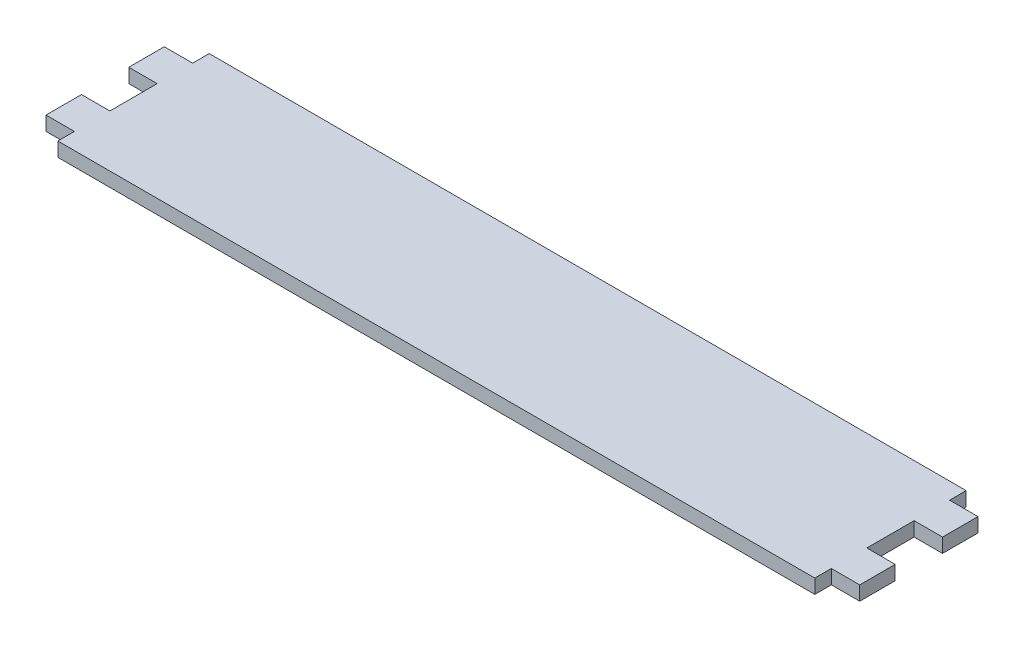
ISO-10303-21;
HEADER;
FILE_DESCRIPTION(('STEP AP214'),'2;1');
FILE_NAME('part.step','',(''),(''),'','','');
FILE_SCHEMA(('AUTOMOTIVE_DESIGN { 1 0 10303 214 1 1 1 1 }'));
ENDSEC;
DATA;
#1=APPLICATION_CONTEXT('core data for automotive mechanical design processes');
#2=APPLICATION_PROTOCOL_DEFINITION('international standard','automotive_design',2000,#1);
#3=PRODUCT_CONTEXT('',#1,'mechanical');
#4=PRODUCT('Part','Part','',(#3));
#5=PRODUCT_RELATED_PRODUCT_CATEGORY('part','',(#4));
#6=PRODUCT_DEFINITION_FORMATION('','',#4);
#7=PRODUCT_DEFINITION_CONTEXT('part definition',#1,'design');
#8=PRODUCT_DEFINITION('design','',#6,#7);
#9=PRODUCT_DEFINITION_SHAPE('','',#8);
#10=(LENGTH_UNIT() NAMED_UNIT(*) SI_UNIT(.MILLI.,.METRE.));
#11=(NAMED_UNIT(*) PLANE_ANGLE_UNIT() SI_UNIT($,.RADIAN.));
#12=(NAMED_UNIT(*) SI_UNIT($,.STERADIAN.) SOLID_ANGLE_UNIT());
#13=UNCERTAINTY_MEASURE_WITH_UNIT(LENGTH_MEASURE(1.E-05),#10,'distance_accuracy_value','');
#14=(GEOMETRIC_REPRESENTATION_CONTEXT(3) GLOBAL_UNCERTAINTY_ASSIGNED_CONTEXT((#13)) GLOBAL_UNIT_ASSIGNED_CONTEXT((#10,
#11,#12)) REPRESENTATION_CONTEXT('',''));
#15=CARTESIAN_POINT('',(0.,0.,0.));
#16=DIRECTION('',(0.,0.,1.));
#17=DIRECTION('',(1.,0.,0.));
#18=AXIS2_PLACEMENT_3D('',#15,#16,#17);
#19=CARTESIAN_POINT('',(160.,6.,-32.));
#20=DIRECTION('',(-1.,0.,0.));
#21=DIRECTION('',(0.,0.,1.));
#22=AXIS2_PLACEMENT_3D('',#19,#20,#21);
#23=PLANE('',#22);
#24=DIRECTION('',(0.,0.,-1.));
#25=VECTOR('',#24,1.);
#26=CARTESIAN_POINT('',(160.,0.,-32.));
#27=LINE('',#26,#25);
#28=CARTESIAN_POINT('',(160.,0.,32.));
#29=VERTEX_POINT('',#28);
#30=CARTESIAN_POINT('',(160.,0.,25.));
#31=VERTEX_POINT('',#30);
#32=EDGE_CURVE('E307',#29,#31,#27,.T.);
#33=ORIENTED_EDGE('',*,*,#32,.T.);
#34=DIRECTION('',(0.,1.,0.));
#35=VECTOR('',#34,1.);
#36=CARTESIAN_POINT('',(160.,6.,25.));
#37=LINE('',#36,#35);
#38=CARTESIAN_POINT('',(160.,6.,25.));
#39=VERTEX_POINT('',#38);
#40=EDGE_CURVE('E56',#31,#39,#37,.T.);
#41=ORIENTED_EDGE('',*,*,#40,.T.);
#42=DIRECTION('',(0.,0.,-1.));
#43=VECTOR('',#42,1.);
#44=CARTESIAN_POINT('',(160.,6.,-32.));
#45=LINE('',#44,#43);
#46=CARTESIAN_POINT('',(160.,6.,32.));
#47=VERTEX_POINT('',#46);
#48=EDGE_CURVE('E178',#47,#39,#45,.T.);
#49=ORIENTED_EDGE('',*,*,#48,.F.);
#50=DIRECTION('',(0.,-1.,0.));
#51=VECTOR('',#50,1.);
#52=CARTESIAN_POINT('',(160.,6.,32.));
#53=LINE('',#52,#51);
#54=EDGE_CURVE('E41',#47,#29,#53,.T.);
#55=ORIENTED_EDGE('',*,*,#54,.T.);
#56=EDGE_LOOP('',(#33,#41,#49,#55));
#57=FACE_BOUND('',#56,.T.);
#58=ADVANCED_FACE('F33',(#57),#23,.F.);
#59=CARTESIAN_POINT('',(160.,6.,-25.));
#60=VERTEX_POINT('',#59);
#61=CARTESIAN_POINT('',(160.,6.,-32.));
#62=VERTEX_POINT('',#61);
#63=EDGE_CURVE('E296',#60,#62,#45,.T.);
#64=ORIENTED_EDGE('',*,*,#63,.F.);
#65=DIRECTION('',(0.,-1.,0.));
#66=VECTOR('',#65,1.);
#67=CARTESIAN_POINT('',(160.,6.,-25.));
#68=LINE('',#67,#66);
#69=CARTESIAN_POINT('',(160.,0.,-25.));
#70=VERTEX_POINT('',#69);
#71=EDGE_CURVE('E181',#60,#70,#68,.T.);
#72=ORIENTED_EDGE('',*,*,#71,.T.);
#73=CARTESIAN_POINT('',(160.,0.,-32.));
#74=VERTEX_POINT('',#73);
#75=EDGE_CURVE('E306',#70,#74,#27,.T.);
#76=ORIENTED_EDGE('',*,*,#75,.T.);
#77=DIRECTION('',(0.,-1.,0.));
#78=VECTOR('',#77,1.);
#79=CARTESIAN_POINT('',(160.,6.,-32.));
#80=LINE('',#79,#78);
#81=EDGE_CURVE('E314',#62,#74,#80,.T.);
#82=ORIENTED_EDGE('',*,*,#81,.F.);
#83=EDGE_LOOP('',(#64,#72,#76,#82));
#84=FACE_BOUND('',#83,.T.);
#85=ADVANCED_FACE('F345',(#84),#23,.F.);
#86=CARTESIAN_POINT('',(-160.,6.,-32.));
#87=DIRECTION('',(1.,0.,0.));
#88=DIRECTION('',(0.,0.,-1.));
#89=AXIS2_PLACEMENT_3D('',#86,#87,#88);
#90=PLANE('',#89);
#91=DIRECTION('',(0.,-1.,0.));
#92=VECTOR('',#91,1.);
#93=CARTESIAN_POINT('',(-160.,6.,10.));
#94=LINE('',#93,#92);
#95=CARTESIAN_POINT('',(-160.,6.,10.));
#96=VERTEX_POINT('',#95);
#97=CARTESIAN_POINT('',(-160.,0.,10.));
#98=VERTEX_POINT('',#97);
#99=EDGE_CURVE('E235',#96,#98,#94,.T.);
#100=ORIENTED_EDGE('',*,*,#99,.F.);
#101=DIRECTION('',(0.,0.,1.));
#102=VECTOR('',#101,1.);
#103=CARTESIAN_POINT('',(-160.,6.,-32.));
#104=LINE('',#103,#102);
#105=CARTESIAN_POINT('',(-160.,6.,-10.));
#106=VERTEX_POINT('',#105);
#107=EDGE_CURVE('E293',#106,#96,#104,.T.);
#108=ORIENTED_EDGE('',*,*,#107,.F.);
#109=DIRECTION('',(0.,1.,0.));
#110=VECTOR('',#109,1.);
#111=CARTESIAN_POINT('',(-160.,6.,-10.));
#112=LINE('',#111,#110);
#113=CARTESIAN_POINT('',(-160.,0.,-10.));
#114=VERTEX_POINT('',#113);
#115=EDGE_CURVE('E267',#114,#106,#112,.T.);
#116=ORIENTED_EDGE('',*,*,#115,.F.);
#117=DIRECTION('',(0.,0.,1.));
#118=VECTOR('',#117,1.);
#119=CARTESIAN_POINT('',(-160.,0.,-32.));
#120=LINE('',#119,#118);
#121=EDGE_CURVE('E304',#114,#98,#120,.T.);
#122=ORIENTED_EDGE('',*,*,#121,.T.);
#123=EDGE_LOOP('',(#100,#108,#116,#122));
#124=FACE_BOUND('',#123,.T.);
#125=ADVANCED_FACE('F370',(#124),#90,.F.);
#126=DIRECTION('',(0.,1.,0.));
#127=VECTOR('',#126,1.);
#128=CARTESIAN_POINT('',(-160.,6.,25.));
#129=LINE('',#128,#127);
#130=CARTESIAN_POINT('',(-160.,0.,25.));
#131=VERTEX_POINT('',#130);
#132=CARTESIAN_POINT('',(-160.,6.,25.));
#133=VERTEX_POINT('',#132);
#134=EDGE_CURVE('E240',#131,#133,#129,.T.);
#135=ORIENTED_EDGE('',*,*,#134,.F.);
#136=CARTESIAN_POINT('',(-160.,0.,32.));
#137=VERTEX_POINT('',#136);
#138=EDGE_CURVE('E289',#131,#137,#120,.T.);
#139=ORIENTED_EDGE('',*,*,#138,.T.);
#140=DIRECTION('',(0.,-1.,0.));
#141=VECTOR('',#140,1.);
#142=CARTESIAN_POINT('',(-160.,6.,32.));
#143=LINE('',#142,#141);
#144=CARTESIAN_POINT('',(-160.,6.,32.));
#145=VERTEX_POINT('',#144);
#146=EDGE_CURVE('E11',#145,#137,#143,.T.);
#147=ORIENTED_EDGE('',*,*,#146,.F.);
#148=EDGE_CURVE('E294',#133,#145,#104,.T.);
#149=ORIENTED_EDGE('',*,*,#148,.F.);
#150=EDGE_LOOP('',(#135,#139,#147,#149));
#151=FACE_BOUND('',#150,.T.);
#152=ADVANCED_FACE('F376',(#151),#90,.F.);
#153=DIRECTION('',(0.,-1.,0.));
#154=VECTOR('',#153,1.);
#155=CARTESIAN_POINT('',(-160.,6.,-25.));
#156=LINE('',#155,#154);
#157=CARTESIAN_POINT('',(-160.,6.,-25.));
#158=VERTEX_POINT('',#157);
#159=CARTESIAN_POINT('',(-160.,0.,-25.));
#160=VERTEX_POINT('',#159);
#161=EDGE_CURVE('E262',#158,#160,#156,.T.);
#162=ORIENTED_EDGE('',*,*,#161,.F.);
#163=CARTESIAN_POINT('',(-160.,6.,-32.));
#164=VERTEX_POINT('',#163);
#165=EDGE_CURVE('E290',#164,#158,#104,.T.);
#166=ORIENTED_EDGE('',*,*,#165,.F.);
#167=DIRECTION('',(0.,-1.,0.));
#168=VECTOR('',#167,1.);
#169=CARTESIAN_POINT('',(-160.,6.,-32.));
#170=LINE('',#169,#168);
#171=CARTESIAN_POINT('',(-160.,0.,-32.));
#172=VERTEX_POINT('',#171);
#173=EDGE_CURVE('E300',#164,#172,#170,.T.);
#174=ORIENTED_EDGE('',*,*,#173,.T.);
#175=EDGE_CURVE('E301',#172,#160,#120,.T.);
#176=ORIENTED_EDGE('',*,*,#175,.T.);
#177=EDGE_LOOP('',(#162,#166,#174,#176));
#178=FACE_BOUND('',#177,.T.);
#179=ADVANCED_FACE('F35',(#178),#90,.F.);
#180=CARTESIAN_POINT('',(160.,6.,32.));
#181=DIRECTION('',(0.,0.,-1.));
#182=DIRECTION('',(-1.,0.,0.));
#183=AXIS2_PLACEMENT_3D('',#180,#181,#182);
#184=PLANE('',#183);
#185=DIRECTION('',(1.,0.,0.));
#186=VECTOR('',#185,1.);
#187=CARTESIAN_POINT('',(160.,0.,32.));
#188=LINE('',#187,#186);
#189=EDGE_CURVE('E303',#137,#29,#188,.T.);
#190=ORIENTED_EDGE('',*,*,#189,.T.);
#191=ORIENTED_EDGE('',*,*,#54,.F.);
#192=DIRECTION('',(1.,0.,0.));
#193=VECTOR('',#192,1.);
#194=CARTESIAN_POINT('',(160.,6.,32.));
#195=LINE('',#194,#193);
#196=EDGE_CURVE('E292',#145,#47,#195,.T.);
#197=ORIENTED_EDGE('',*,*,#196,.F.);
#198=ORIENTED_EDGE('',*,*,#146,.T.);
#199=EDGE_LOOP('',(#190,#191,#197,#198));
#200=FACE_BOUND('',#199,.T.);
#201=ADVANCED_FACE('F387',(#200),#184,.F.);
#202=CARTESIAN_POINT('',(160.,6.,10.));
#203=VERTEX_POINT('',#202);
#204=CARTESIAN_POINT('',(160.,6.,-10.));
#205=VERTEX_POINT('',#204);
#206=EDGE_CURVE('E48',#203,#205,#45,.T.);
#207=ORIENTED_EDGE('',*,*,#206,.F.);
#208=DIRECTION('',(0.,-1.,0.));
#209=VECTOR('',#208,1.);
#210=CARTESIAN_POINT('',(160.,6.,10.));
#211=LINE('',#210,#209);
#212=CARTESIAN_POINT('',(160.,0.,10.));
#213=VERTEX_POINT('',#212);
#214=EDGE_CURVE('E192',#203,#213,#211,.T.);
#215=ORIENTED_EDGE('',*,*,#214,.T.);
#216=CARTESIAN_POINT('',(160.,0.,-10.));
#217=VERTEX_POINT('',#216);
#218=EDGE_CURVE('E310',#213,#217,#27,.T.);
#219=ORIENTED_EDGE('',*,*,#218,.T.);
#220=DIRECTION('',(0.,1.,0.));
#221=VECTOR('',#220,1.);
#222=CARTESIAN_POINT('',(160.,6.,-10.));
#223=LINE('',#222,#221);
#224=EDGE_CURVE('E213',#217,#205,#223,.T.);
#225=ORIENTED_EDGE('',*,*,#224,.T.);
#226=EDGE_LOOP('',(#207,#215,#219,#225));
#227=FACE_BOUND('',#226,.T.);
#228=ADVANCED_FACE('F333',(#227),#23,.F.);
#229=CARTESIAN_POINT('',(160.,6.,-32.));
#230=DIRECTION('',(0.,0.,1.));
#231=DIRECTION('',(1.,0.,0.));
#232=AXIS2_PLACEMENT_3D('',#229,#230,#231);
#233=PLANE('',#232);
#234=DIRECTION('',(-1.,0.,0.));
#235=VECTOR('',#234,1.);
#236=CARTESIAN_POINT('',(160.,0.,-32.));
#237=LINE('',#236,#235);
#238=EDGE_CURVE('E309',#74,#172,#237,.T.);
#239=ORIENTED_EDGE('',*,*,#238,.T.);
#240=ORIENTED_EDGE('',*,*,#173,.F.);
#241=DIRECTION('',(-1.,0.,0.));
#242=VECTOR('',#241,1.);
#243=CARTESIAN_POINT('',(160.,6.,-32.));
#244=LINE('',#243,#242);
#245=EDGE_CURVE('E298',#62,#164,#244,.T.);
#246=ORIENTED_EDGE('',*,*,#245,.F.);
#247=ORIENTED_EDGE('',*,*,#81,.T.);
#248=EDGE_LOOP('',(#239,#240,#246,#247));
#249=FACE_BOUND('',#248,.T.);
#250=ADVANCED_FACE('F350',(#249),#233,.F.);
#251=CARTESIAN_POINT('',(0.,6.,0.));
#252=DIRECTION('',(0.,-1.,0.));
#253=DIRECTION('',(0.,0.,-1.));
#254=AXIS2_PLACEMENT_3D('',#251,#252,#253);
#255=PLANE('',#254);
#256=ORIENTED_EDGE('',*,*,#165,.T.);
#257=DIRECTION('',(1.,0.,0.));
#258=VECTOR('',#257,1.);
#259=CARTESIAN_POINT('',(-172.,6.,-25.));
#260=LINE('',#259,#258);
#261=CARTESIAN_POINT('',(-172.,6.,-25.));
#262=VERTEX_POINT('',#261);
#263=EDGE_CURVE('E273',#262,#158,#260,.T.);
#264=ORIENTED_EDGE('',*,*,#263,.F.);
#265=DIRECTION('',(0.,0.,-1.));
#266=VECTOR('',#265,1.);
#267=CARTESIAN_POINT('',(-172.,6.,-25.));
#268=LINE('',#267,#266);
#269=CARTESIAN_POINT('',(-172.,6.,-10.));
#270=VERTEX_POINT('',#269);
#271=EDGE_CURVE('E271',#270,#262,#268,.T.);
#272=ORIENTED_EDGE('',*,*,#271,.F.);
#273=DIRECTION('',(1.,0.,0.));
#274=VECTOR('',#273,1.);
#275=CARTESIAN_POINT('',(-172.,6.,-10.));
#276=LINE('',#275,#274);
#277=EDGE_CURVE('E280',#270,#106,#276,.T.);
#278=ORIENTED_EDGE('',*,*,#277,.T.);
#279=ORIENTED_EDGE('',*,*,#107,.T.);
#280=DIRECTION('',(1.,0.,0.));
#281=VECTOR('',#280,1.);
#282=CARTESIAN_POINT('',(-172.,6.,10.));
#283=LINE('',#282,#281);
#284=CARTESIAN_POINT('',(-172.,6.,10.));
#285=VERTEX_POINT('',#284);
#286=EDGE_CURVE('E259',#285,#96,#283,.T.);
#287=ORIENTED_EDGE('',*,*,#286,.F.);
#288=DIRECTION('',(0.,0.,-1.));
#289=VECTOR('',#288,1.);
#290=CARTESIAN_POINT('',(-172.,6.,25.));
#291=LINE('',#290,#289);
#292=CARTESIAN_POINT('',(-172.,6.,25.));
#293=VERTEX_POINT('',#292);
#294=EDGE_CURVE('E236',#293,#285,#291,.T.);
#295=ORIENTED_EDGE('',*,*,#294,.F.);
#296=DIRECTION('',(1.,0.,0.));
#297=VECTOR('',#296,1.);
#298=CARTESIAN_POINT('',(-172.,6.,25.));
#299=LINE('',#298,#297);
#300=EDGE_CURVE('E246',#293,#133,#299,.T.);
#301=ORIENTED_EDGE('',*,*,#300,.T.);
#302=ORIENTED_EDGE('',*,*,#148,.T.);
#303=ORIENTED_EDGE('',*,*,#196,.T.);
#304=ORIENTED_EDGE('',*,*,#48,.T.);
#305=DIRECTION('',(-1.,0.,0.));
#306=VECTOR('',#305,1.);
#307=CARTESIAN_POINT('',(172.,6.,25.));
#308=LINE('',#307,#306);
#309=CARTESIAN_POINT('',(172.,6.,25.));
#310=VERTEX_POINT('',#309);
#311=EDGE_CURVE('E172',#310,#39,#308,.T.);
#312=ORIENTED_EDGE('',*,*,#311,.F.);
#313=DIRECTION('',(0.,0.,-1.));
#314=VECTOR('',#313,1.);
#315=CARTESIAN_POINT('',(172.,6.,25.));
#316=LINE('',#315,#314);
#317=CARTESIAN_POINT('',(172.,6.,10.));
#318=VERTEX_POINT('',#317);
#319=EDGE_CURVE('E176',#310,#318,#316,.T.);
#320=ORIENTED_EDGE('',*,*,#319,.T.);
#321=DIRECTION('',(-1.,0.,0.));
#322=VECTOR('',#321,1.);
#323=CARTESIAN_POINT('',(172.,6.,10.));
#324=LINE('',#323,#322);
#325=EDGE_CURVE('E201',#318,#203,#324,.T.);
#326=ORIENTED_EDGE('',*,*,#325,.T.);
#327=ORIENTED_EDGE('',*,*,#206,.T.);
#328=DIRECTION('',(-1.,0.,0.));
#329=VECTOR('',#328,1.);
#330=CARTESIAN_POINT('',(172.,6.,-10.));
#331=LINE('',#330,#329);
#332=CARTESIAN_POINT('',(172.,6.,-10.));
#333=VERTEX_POINT('',#332);
#334=EDGE_CURVE('E230',#333,#205,#331,.T.);
#335=ORIENTED_EDGE('',*,*,#334,.F.);
#336=DIRECTION('',(0.,0.,-1.));
#337=VECTOR('',#336,1.);
#338=CARTESIAN_POINT('',(172.,6.,-25.));
#339=LINE('',#338,#337);
#340=CARTESIAN_POINT('',(172.,6.,-25.));
#341=VERTEX_POINT('',#340);
#342=EDGE_CURVE('E212',#333,#341,#339,.T.);
#343=ORIENTED_EDGE('',*,*,#342,.T.);
#344=DIRECTION('',(-1.,0.,0.));
#345=VECTOR('',#344,1.);
#346=CARTESIAN_POINT('',(172.,6.,-25.));
#347=LINE('',#346,#345);
#348=EDGE_CURVE('E233',#341,#60,#347,.T.);
#349=ORIENTED_EDGE('',*,*,#348,.T.);
#350=ORIENTED_EDGE('',*,*,#63,.T.);
#351=ORIENTED_EDGE('',*,*,#245,.T.);
#352=EDGE_LOOP('',(#256,#264,#272,#278,#279,#287,#295,#301,#302,#303,#304,#312,#320,#326,#327,
#335,#343,#349,#350,#351));
#353=FACE_BOUND('',#352,.T.);
#354=ADVANCED_FACE('F175',(#353),#255,.F.);
#355=CARTESIAN_POINT('',(0.,0.,0.));
#356=DIRECTION('',(0.,-1.,0.));
#357=DIRECTION('',(0.,0.,-1.));
#358=AXIS2_PLACEMENT_3D('',#355,#356,#357);
#359=PLANE('',#358);
#360=ORIENTED_EDGE('',*,*,#175,.F.);
#361=ORIENTED_EDGE('',*,*,#238,.F.);
#362=ORIENTED_EDGE('',*,*,#75,.F.);
#363=DIRECTION('',(-1.,0.,0.));
#364=VECTOR('',#363,1.);
#365=CARTESIAN_POINT('',(172.,0.,-25.));
#366=LINE('',#365,#364);
#367=CARTESIAN_POINT('',(172.,0.,-25.));
#368=VERTEX_POINT('',#367);
#369=EDGE_CURVE('E222',#368,#70,#366,.T.);
#370=ORIENTED_EDGE('',*,*,#369,.F.);
#371=DIRECTION('',(0.,0.,1.));
#372=VECTOR('',#371,1.);
#373=CARTESIAN_POINT('',(172.,0.,-25.));
#374=LINE('',#373,#372);
#375=CARTESIAN_POINT('',(172.,0.,-10.));
#376=VERTEX_POINT('',#375);
#377=EDGE_CURVE('E219',#368,#376,#374,.T.);
#378=ORIENTED_EDGE('',*,*,#377,.T.);
#379=DIRECTION('',(-1.,0.,0.));
#380=VECTOR('',#379,1.);
#381=CARTESIAN_POINT('',(172.,0.,-10.));
#382=LINE('',#381,#380);
#383=EDGE_CURVE('E227',#376,#217,#382,.T.);
#384=ORIENTED_EDGE('',*,*,#383,.T.);
#385=ORIENTED_EDGE('',*,*,#218,.F.);
#386=DIRECTION('',(-1.,0.,0.));
#387=VECTOR('',#386,1.);
#388=CARTESIAN_POINT('',(172.,0.,10.));
#389=LINE('',#388,#387);
#390=CARTESIAN_POINT('',(172.,0.,10.));
#391=VERTEX_POINT('',#390);
#392=EDGE_CURVE('E205',#391,#213,#389,.T.);
#393=ORIENTED_EDGE('',*,*,#392,.F.);
#394=DIRECTION('',(0.,0.,1.));
#395=VECTOR('',#394,1.);
#396=CARTESIAN_POINT('',(172.,0.,25.));
#397=LINE('',#396,#395);
#398=CARTESIAN_POINT('',(172.,0.,25.));
#399=VERTEX_POINT('',#398);
#400=EDGE_CURVE('E196',#391,#399,#397,.T.);
#401=ORIENTED_EDGE('',*,*,#400,.T.);
#402=DIRECTION('',(-1.,0.,0.));
#403=VECTOR('',#402,1.);
#404=CARTESIAN_POINT('',(172.,0.,25.));
#405=LINE('',#404,#403);
#406=EDGE_CURVE('E182',#399,#31,#405,.T.);
#407=ORIENTED_EDGE('',*,*,#406,.T.);
#408=ORIENTED_EDGE('',*,*,#32,.F.);
#409=ORIENTED_EDGE('',*,*,#189,.F.);
#410=ORIENTED_EDGE('',*,*,#138,.F.);
#411=DIRECTION('',(1.,0.,0.));
#412=VECTOR('',#411,1.);
#413=CARTESIAN_POINT('',(-172.,0.,25.));
#414=LINE('',#413,#412);
#415=CARTESIAN_POINT('',(-172.,0.,25.));
#416=VERTEX_POINT('',#415);
#417=EDGE_CURVE('E253',#416,#131,#414,.T.);
#418=ORIENTED_EDGE('',*,*,#417,.F.);
#419=DIRECTION('',(0.,0.,1.));
#420=VECTOR('',#419,1.);
#421=CARTESIAN_POINT('',(-172.,0.,25.));
#422=LINE('',#421,#420);
#423=CARTESIAN_POINT('',(-172.,0.,10.));
#424=VERTEX_POINT('',#423);
#425=EDGE_CURVE('E242',#424,#416,#422,.T.);
#426=ORIENTED_EDGE('',*,*,#425,.F.);
#427=DIRECTION('',(1.,0.,0.));
#428=VECTOR('',#427,1.);
#429=CARTESIAN_POINT('',(-172.,0.,10.));
#430=LINE('',#429,#428);
#431=EDGE_CURVE('E256',#424,#98,#430,.T.);
#432=ORIENTED_EDGE('',*,*,#431,.T.);
#433=ORIENTED_EDGE('',*,*,#121,.F.);
#434=DIRECTION('',(1.,0.,0.));
#435=VECTOR('',#434,1.);
#436=CARTESIAN_POINT('',(-172.,0.,-10.));
#437=LINE('',#436,#435);
#438=CARTESIAN_POINT('',(-172.,0.,-10.));
#439=VERTEX_POINT('',#438);
#440=EDGE_CURVE('E283',#439,#114,#437,.T.);
#441=ORIENTED_EDGE('',*,*,#440,.F.);
#442=DIRECTION('',(0.,0.,1.));
#443=VECTOR('',#442,1.);
#444=CARTESIAN_POINT('',(-172.,0.,-25.));
#445=LINE('',#444,#443);
#446=CARTESIAN_POINT('',(-172.,0.,-25.));
#447=VERTEX_POINT('',#446);
#448=EDGE_CURVE('E266',#447,#439,#445,.T.);
#449=ORIENTED_EDGE('',*,*,#448,.F.);
#450=DIRECTION('',(1.,0.,0.));
#451=VECTOR('',#450,1.);
#452=CARTESIAN_POINT('',(-172.,0.,-25.));
#453=LINE('',#452,#451);
#454=EDGE_CURVE('E286',#447,#160,#453,.T.);
#455=ORIENTED_EDGE('',*,*,#454,.T.);
#456=EDGE_LOOP('',(#360,#361,#362,#370,#378,#384,#385,#393,#401,#407,#408,#409,#410,#418,#426,
#432,#433,#441,#449,#455));
#457=FACE_BOUND('',#456,.T.);
#458=ADVANCED_FACE('F324',(#457),#359,.T.);
#459=CARTESIAN_POINT('',(-172.,6.,-25.));
#460=DIRECTION('',(0.,0.,1.));
#461=DIRECTION('',(1.,0.,0.));
#462=AXIS2_PLACEMENT_3D('',#459,#460,#461);
#463=PLANE('',#462);
#464=ORIENTED_EDGE('',*,*,#161,.T.);
#465=ORIENTED_EDGE('',*,*,#454,.F.);
#466=DIRECTION('',(0.,-1.,0.));
#467=VECTOR('',#466,1.);
#468=CARTESIAN_POINT('',(-172.,6.,-25.));
#469=LINE('',#468,#467);
#470=EDGE_CURVE('E263',#262,#447,#469,.T.);
#471=ORIENTED_EDGE('',*,*,#470,.F.);
#472=ORIENTED_EDGE('',*,*,#263,.T.);
#473=EDGE_LOOP('',(#464,#465,#471,#472));
#474=FACE_BOUND('',#473,.T.);
#475=ADVANCED_FACE('F357',(#474),#463,.F.);
#476=CARTESIAN_POINT('',(-172.,6.,-10.));
#477=DIRECTION('',(0.,0.,-1.));
#478=DIRECTION('',(0.,1.,0.));
#479=AXIS2_PLACEMENT_3D('',#476,#477,#478);
#480=PLANE('',#479);
#481=ORIENTED_EDGE('',*,*,#115,.T.);
#482=ORIENTED_EDGE('',*,*,#277,.F.);
#483=DIRECTION('',(0.,1.,0.));
#484=VECTOR('',#483,1.);
#485=CARTESIAN_POINT('',(-172.,6.,-10.));
#486=LINE('',#485,#484);
#487=EDGE_CURVE('E269',#439,#270,#486,.T.);
#488=ORIENTED_EDGE('',*,*,#487,.F.);
#489=ORIENTED_EDGE('',*,*,#440,.T.);
#490=EDGE_LOOP('',(#481,#482,#488,#489));
#491=FACE_BOUND('',#490,.T.);
#492=ADVANCED_FACE('F367',(#491),#480,.F.);
#493=CARTESIAN_POINT('',(-172.,0.,0.));
#494=DIRECTION('',(-1.,0.,0.));
#495=DIRECTION('',(0.,0.,1.));
#496=AXIS2_PLACEMENT_3D('',#493,#494,#495);
#497=PLANE('',#496);
#498=ORIENTED_EDGE('',*,*,#470,.T.);
#499=ORIENTED_EDGE('',*,*,#448,.T.);
#500=ORIENTED_EDGE('',*,*,#487,.T.);
#501=ORIENTED_EDGE('',*,*,#271,.T.);
#502=EDGE_LOOP('',(#498,#499,#500,#501));
#503=FACE_BOUND('',#502,.T.);
#504=ADVANCED_FACE('F360',(#503),#497,.T.);
#505=CARTESIAN_POINT('',(-172.,6.,10.));
#506=DIRECTION('',(0.,0.,1.));
#507=DIRECTION('',(0.,-1.,0.));
#508=AXIS2_PLACEMENT_3D('',#505,#506,#507);
#509=PLANE('',#508);
#510=ORIENTED_EDGE('',*,*,#99,.T.);
#511=ORIENTED_EDGE('',*,*,#431,.F.);
#512=DIRECTION('',(0.,-1.,0.));
#513=VECTOR('',#512,1.);
#514=CARTESIAN_POINT('',(-172.,6.,10.));
#515=LINE('',#514,#513);
#516=EDGE_CURVE('E239',#285,#424,#515,.T.);
#517=ORIENTED_EDGE('',*,*,#516,.F.);
#518=ORIENTED_EDGE('',*,*,#286,.T.);
#519=EDGE_LOOP('',(#510,#511,#517,#518));
#520=FACE_BOUND('',#519,.T.);
#521=ADVANCED_FACE('F386',(#520),#509,.F.);
#522=CARTESIAN_POINT('',(-172.,6.,25.));
#523=DIRECTION('',(0.,0.,-1.));
#524=DIRECTION('',(-1.,0.,0.));
#525=AXIS2_PLACEMENT_3D('',#522,#523,#524);
#526=PLANE('',#525);
#527=ORIENTED_EDGE('',*,*,#134,.T.);
#528=ORIENTED_EDGE('',*,*,#300,.F.);
#529=DIRECTION('',(0.,1.,0.));
#530=VECTOR('',#529,1.);
#531=CARTESIAN_POINT('',(-172.,6.,25.));
#532=LINE('',#531,#530);
#533=EDGE_CURVE('E244',#416,#293,#532,.T.);
#534=ORIENTED_EDGE('',*,*,#533,.F.);
#535=ORIENTED_EDGE('',*,*,#417,.T.);
#536=EDGE_LOOP('',(#527,#528,#534,#535));
#537=FACE_BOUND('',#536,.T.);
#538=ADVANCED_FACE('F381',(#537),#526,.F.);
#539=CARTESIAN_POINT('',(-172.,0.,0.));
#540=DIRECTION('',(-1.,0.,0.));
#541=DIRECTION('',(0.,0.,1.));
#542=AXIS2_PLACEMENT_3D('',#539,#540,#541);
#543=PLANE('',#542);
#544=ORIENTED_EDGE('',*,*,#294,.T.);
#545=ORIENTED_EDGE('',*,*,#516,.T.);
#546=ORIENTED_EDGE('',*,*,#425,.T.);
#547=ORIENTED_EDGE('',*,*,#533,.T.);
#548=EDGE_LOOP('',(#544,#545,#546,#547));
#549=FACE_BOUND('',#548,.T.);
#550=ADVANCED_FACE('F384',(#549),#543,.T.);
#551=CARTESIAN_POINT('',(172.,6.,-25.));
#552=DIRECTION('',(0.,0.,-1.));
#553=DIRECTION('',(-1.,0.,0.));
#554=AXIS2_PLACEMENT_3D('',#551,#552,#553);
#555=PLANE('',#554);
#556=ORIENTED_EDGE('',*,*,#71,.F.);
#557=ORIENTED_EDGE('',*,*,#348,.F.);
#558=DIRECTION('',(0.,-1.,0.));
#559=VECTOR('',#558,1.);
#560=CARTESIAN_POINT('',(172.,6.,-25.));
#561=LINE('',#560,#559);
#562=EDGE_CURVE('E209',#341,#368,#561,.T.);
#563=ORIENTED_EDGE('',*,*,#562,.T.);
#564=ORIENTED_EDGE('',*,*,#369,.T.);
#565=EDGE_LOOP('',(#556,#557,#563,#564));
#566=FACE_BOUND('',#565,.T.);
#567=ADVANCED_FACE('F342',(#566),#555,.T.);
#568=CARTESIAN_POINT('',(172.,6.,-10.));
#569=DIRECTION('',(0.,0.,1.));
#570=DIRECTION('',(0.,-1.,0.));
#571=AXIS2_PLACEMENT_3D('',#568,#569,#570);
#572=PLANE('',#571);
#573=ORIENTED_EDGE('',*,*,#224,.F.);
#574=ORIENTED_EDGE('',*,*,#383,.F.);
#575=DIRECTION('',(0.,1.,0.));
#576=VECTOR('',#575,1.);
#577=CARTESIAN_POINT('',(172.,6.,-10.));
#578=LINE('',#577,#576);
#579=EDGE_CURVE('E216',#376,#333,#578,.T.);
#580=ORIENTED_EDGE('',*,*,#579,.T.);
#581=ORIENTED_EDGE('',*,*,#334,.T.);
#582=EDGE_LOOP('',(#573,#574,#580,#581));
#583=FACE_BOUND('',#582,.T.);
#584=ADVANCED_FACE('F331',(#583),#572,.T.);
#585=CARTESIAN_POINT('',(172.,0.,0.));
#586=DIRECTION('',(1.,0.,0.));
#587=DIRECTION('',(0.,0.,1.));
#588=AXIS2_PLACEMENT_3D('',#585,#586,#587);
#589=PLANE('',#588);
#590=ORIENTED_EDGE('',*,*,#562,.F.);
#591=ORIENTED_EDGE('',*,*,#342,.F.);
#592=ORIENTED_EDGE('',*,*,#579,.F.);
#593=ORIENTED_EDGE('',*,*,#377,.F.);
#594=EDGE_LOOP('',(#590,#591,#592,#593));
#595=FACE_BOUND('',#594,.T.);
#596=ADVANCED_FACE('F337',(#595),#589,.T.);
#597=CARTESIAN_POINT('',(172.,6.,25.));
#598=DIRECTION('',(0.,0.,1.));
#599=DIRECTION('',(1.,0.,0.));
#600=AXIS2_PLACEMENT_3D('',#597,#598,#599);
#601=PLANE('',#600);
#602=ORIENTED_EDGE('',*,*,#40,.F.);
#603=ORIENTED_EDGE('',*,*,#406,.F.);
#604=DIRECTION('',(0.,1.,0.));
#605=VECTOR('',#604,1.);
#606=CARTESIAN_POINT('',(172.,6.,25.));
#607=LINE('',#606,#605);
#608=EDGE_CURVE('E188',#399,#310,#607,.T.);
#609=ORIENTED_EDGE('',*,*,#608,.T.);
#610=ORIENTED_EDGE('',*,*,#311,.T.);
#611=EDGE_LOOP('',(#602,#603,#609,#610));
#612=FACE_BOUND('',#611,.T.);
#613=ADVANCED_FACE('F194',(#612),#601,.T.);
#614=CARTESIAN_POINT('',(172.,6.,10.));
#615=DIRECTION('',(0.,0.,-1.));
#616=DIRECTION('',(0.,1.,0.));
#617=AXIS2_PLACEMENT_3D('',#614,#615,#616);
#618=PLANE('',#617);
#619=ORIENTED_EDGE('',*,*,#214,.F.);
#620=ORIENTED_EDGE('',*,*,#325,.F.);
#621=DIRECTION('',(0.,-1.,0.));
#622=VECTOR('',#621,1.);
#623=CARTESIAN_POINT('',(172.,6.,10.));
#624=LINE('',#623,#622);
#625=EDGE_CURVE('E191',#318,#391,#624,.T.);
#626=ORIENTED_EDGE('',*,*,#625,.T.);
#627=ORIENTED_EDGE('',*,*,#392,.T.);
#628=EDGE_LOOP('',(#619,#620,#626,#627));
#629=FACE_BOUND('',#628,.T.);
#630=ADVANCED_FACE('F327',(#629),#618,.T.);
#631=CARTESIAN_POINT('',(172.,0.,0.));
#632=DIRECTION('',(1.,0.,0.));
#633=DIRECTION('',(0.,0.,1.));
#634=AXIS2_PLACEMENT_3D('',#631,#632,#633);
#635=PLANE('',#634);
#636=ORIENTED_EDGE('',*,*,#319,.F.);
#637=ORIENTED_EDGE('',*,*,#608,.F.);
#638=ORIENTED_EDGE('',*,*,#400,.F.);
#639=ORIENTED_EDGE('',*,*,#625,.F.);
#640=EDGE_LOOP('',(#636,#637,#638,#639));
#641=FACE_BOUND('',#640,.T.);
#642=ADVANCED_FACE('F186',(#641),#635,.T.);
#643=CLOSED_SHELL('',(#58,#85,#125,#152,#179,#201,#228,#250,#354,#458,#475,#492,#504,#521,#538,
#550,#567,#584,#596,#613,#630,#642));
#644=MANIFOLD_SOLID_BREP('B2',#643);
#645=ADVANCED_BREP_SHAPE_REPRESENTATION('',(#18,#644),#14);
#646=SHAPE_DEFINITION_REPRESENTATION(#9,#645);
ENDSEC;
END-ISO-10303-21;
